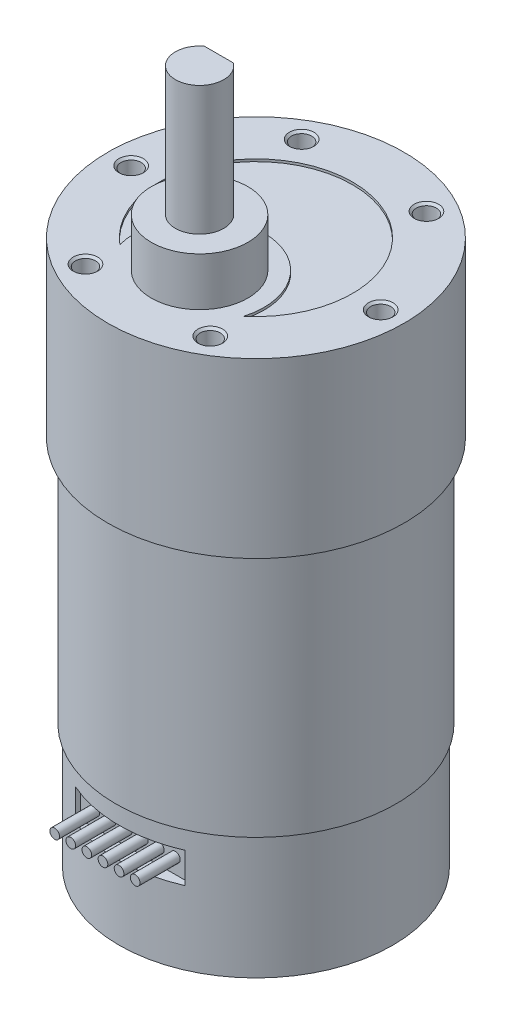
ISO-10303-21;
HEADER;
FILE_DESCRIPTION(('STEP AP214'),'2;1');
FILE_NAME('part.step','',(''),(''),'','','');
FILE_SCHEMA(('AUTOMOTIVE_DESIGN { 1 0 10303 214 1 1 1 1 }'));
ENDSEC;
DATA;
#1=APPLICATION_CONTEXT('core data for automotive mechanical design processes');
#2=APPLICATION_PROTOCOL_DEFINITION('international standard','automotive_design',2000,#1);
#3=PRODUCT_CONTEXT('',#1,'mechanical');
#4=PRODUCT('Part','Part','',(#3));
#5=PRODUCT_RELATED_PRODUCT_CATEGORY('part','',(#4));
#6=PRODUCT_DEFINITION_FORMATION('','',#4);
#7=PRODUCT_DEFINITION_CONTEXT('part definition',#1,'design');
#8=PRODUCT_DEFINITION('design','',#6,#7);
#9=PRODUCT_DEFINITION_SHAPE('','',#8);
#10=(LENGTH_UNIT() NAMED_UNIT(*) SI_UNIT(.MILLI.,.METRE.));
#11=(NAMED_UNIT(*) PLANE_ANGLE_UNIT() SI_UNIT($,.RADIAN.));
#12=(NAMED_UNIT(*) SI_UNIT($,.STERADIAN.) SOLID_ANGLE_UNIT());
#13=UNCERTAINTY_MEASURE_WITH_UNIT(LENGTH_MEASURE(1.E-05),#10,'distance_accuracy_value','');
#14=(GEOMETRIC_REPRESENTATION_CONTEXT(3) GLOBAL_UNCERTAINTY_ASSIGNED_CONTEXT((#13)) GLOBAL_UNIT_ASSIGNED_CONTEXT((#10,
#11,#12)) REPRESENTATION_CONTEXT('',''));
#15=CARTESIAN_POINT('',(0.,0.,0.));
#16=DIRECTION('',(0.,0.,1.));
#17=DIRECTION('',(1.,0.,0.));
#18=AXIS2_PLACEMENT_3D('',#15,#16,#17);
#19=CARTESIAN_POINT('',(0.,-67.6,0.));
#20=DIRECTION('',(0.,1.,0.));
#21=DIRECTION('',(0.,0.,1.));
#22=AXIS2_PLACEMENT_3D('',#19,#20,#21);
#23=CYLINDRICAL_SURFACE('',#22,17.);
#24=CARTESIAN_POINT('',(0.,-52.2,0.));
#25=DIRECTION('',(0.,-1.,0.));
#26=DIRECTION('',(0.,0.,-1.));
#27=AXIS2_PLACEMENT_3D('',#24,#25,#26);
#28=CIRCLE('',#27,17.);
#29=CARTESIAN_POINT('',(0.,-52.2,-17.));
#30=VERTEX_POINT('',#29);
#31=EDGE_CURVE('E249',#30,#30,#28,.T.);
#32=ORIENTED_EDGE('',*,*,#31,.T.);
#33=EDGE_LOOP('',(#32));
#34=FACE_BOUND('',#33,.T.);
#35=CARTESIAN_POINT('',(0.,-67.6,0.));
#36=DIRECTION('',(0.,-1.,0.));
#37=DIRECTION('',(0.,0.,-1.));
#38=AXIS2_PLACEMENT_3D('',#35,#36,#37);
#39=CIRCLE('',#38,17.);
#40=CARTESIAN_POINT('',(0.,-67.6,-17.));
#41=VERTEX_POINT('',#40);
#42=EDGE_CURVE('E250',#41,#41,#39,.T.);
#43=ORIENTED_EDGE('',*,*,#42,.F.);
#44=EDGE_LOOP('',(#43));
#45=FACE_BOUND('',#44,.T.);
#46=DIRECTION('',(0.,1.,0.));
#47=VECTOR('',#46,1.);
#48=CARTESIAN_POINT('',(-6.8,-67.6,15.5807573628499));
#49=LINE('',#48,#47);
#50=CARTESIAN_POINT('',(-6.8,-54.7,15.5807573628499));
#51=VERTEX_POINT('',#50);
#52=CARTESIAN_POINT('',(-6.8,-58.5,15.5807573628499));
#53=VERTEX_POINT('',#52);
#54=EDGE_CURVE('E11',#51,#53,#49,.F.);
#55=ORIENTED_EDGE('',*,*,#54,.F.);
#56=CARTESIAN_POINT('',(0.,-54.7,0.));
#57=DIRECTION('',(0.,-1.,0.));
#58=DIRECTION('',(0.,0.,-1.));
#59=AXIS2_PLACEMENT_3D('',#56,#57,#58);
#60=CIRCLE('',#59,17.);
#61=CARTESIAN_POINT('',(6.8,-54.7,15.5807573628499));
#62=VERTEX_POINT('',#61);
#63=EDGE_CURVE('E292',#62,#51,#60,.T.);
#64=ORIENTED_EDGE('',*,*,#63,.F.);
#65=DIRECTION('',(0.,1.,0.));
#66=VECTOR('',#65,1.);
#67=CARTESIAN_POINT('',(6.8,-67.6,15.5807573628499));
#68=LINE('',#67,#66);
#69=CARTESIAN_POINT('',(6.8,-58.5,15.5807573628499));
#70=VERTEX_POINT('',#69);
#71=EDGE_CURVE('E294',#70,#62,#68,.T.);
#72=ORIENTED_EDGE('',*,*,#71,.F.);
#73=CARTESIAN_POINT('',(0.,-58.5,0.));
#74=DIRECTION('',(0.,1.,0.));
#75=DIRECTION('',(0.,0.,1.));
#76=AXIS2_PLACEMENT_3D('',#73,#74,#75);
#77=CIRCLE('',#76,17.);
#78=EDGE_CURVE('E46',#53,#70,#77,.T.);
#79=ORIENTED_EDGE('',*,*,#78,.F.);
#80=EDGE_LOOP('',(#55,#64,#72,#79));
#81=FACE_BOUND('',#80,.T.);
#82=ADVANCED_FACE('F38',(#34,#45,#81),#23,.T.);
#83=CARTESIAN_POINT('',(0.,-21.5,0.));
#84=DIRECTION('',(0.,1.,0.));
#85=DIRECTION('',(0.,0.,1.));
#86=AXIS2_PLACEMENT_3D('',#83,#84,#85);
#87=CYLINDRICAL_SURFACE('',#86,18.4);
#88=CARTESIAN_POINT('',(0.,-21.5,0.));
#89=DIRECTION('',(0.,1.,0.));
#90=DIRECTION('',(0.,0.,1.));
#91=AXIS2_PLACEMENT_3D('',#88,#89,#90);
#92=CIRCLE('',#91,18.4);
#93=CARTESIAN_POINT('',(0.,-21.5,18.4));
#94=VERTEX_POINT('',#93);
#95=EDGE_CURVE('E280',#94,#94,#92,.T.);
#96=ORIENTED_EDGE('',*,*,#95,.T.);
#97=EDGE_LOOP('',(#96));
#98=FACE_BOUND('',#97,.T.);
#99=CARTESIAN_POINT('',(0.,0.,0.));
#100=DIRECTION('',(0.,1.,0.));
#101=DIRECTION('',(0.,0.,1.));
#102=AXIS2_PLACEMENT_3D('',#99,#100,#101);
#103=CIRCLE('',#102,18.4);
#104=CARTESIAN_POINT('',(0.,0.,18.4));
#105=VERTEX_POINT('',#104);
#106=EDGE_CURVE('E277',#105,#105,#103,.T.);
#107=ORIENTED_EDGE('',*,*,#106,.F.);
#108=EDGE_LOOP('',(#107));
#109=FACE_BOUND('',#108,.T.);
#110=ADVANCED_FACE('F40',(#98,#109),#87,.T.);
#111=CARTESIAN_POINT('',(0.,-21.5,0.));
#112=DIRECTION('',(0.,1.,0.));
#113=DIRECTION('',(0.,0.,1.));
#114=AXIS2_PLACEMENT_3D('',#111,#112,#113);
#115=PLANE('',#114);
#116=CARTESIAN_POINT('',(0.,-21.5,0.));
#117=DIRECTION('',(0.,1.,0.));
#118=DIRECTION('',(0.,0.,1.));
#119=AXIS2_PLACEMENT_3D('',#116,#117,#118);
#120=CIRCLE('',#119,17.4);
#121=CARTESIAN_POINT('',(0.,-21.5,17.4));
#122=VERTEX_POINT('',#121);
#123=EDGE_CURVE('E289',#122,#122,#120,.F.);
#124=ORIENTED_EDGE('',*,*,#123,.F.);
#125=EDGE_LOOP('',(#124));
#126=FACE_BOUND('',#125,.T.);
#127=ORIENTED_EDGE('',*,*,#95,.F.);
#128=EDGE_LOOP('',(#127));
#129=FACE_BOUND('',#128,.T.);
#130=ADVANCED_FACE('F335',(#126,#129),#115,.F.);
#131=CARTESIAN_POINT('',(0.,0.,0.));
#132=DIRECTION('',(0.,1.,0.));
#133=DIRECTION('',(0.,0.,1.));
#134=AXIS2_PLACEMENT_3D('',#131,#132,#133);
#135=PLANE('',#134);
#136=CARTESIAN_POINT('',(0.,0.,7.));
#137=DIRECTION('',(0.,-1.,0.));
#138=DIRECTION('',(0.,0.,1.));
#139=AXIS2_PLACEMENT_3D('',#136,#137,#138);
#140=CIRCLE('',#139,8.);
#141=CARTESIAN_POINT('',(-7.6874533348509,0.,9.21428571428572));
#142=VERTEX_POINT('',#141);
#143=CARTESIAN_POINT('',(7.6874533348509,0.,9.21428571428571));
#144=VERTEX_POINT('',#143);
#145=EDGE_CURVE('E53',#142,#144,#140,.T.);
#146=ORIENTED_EDGE('',*,*,#145,.F.);
#147=CARTESIAN_POINT('',(0.,0.,0.));
#148=DIRECTION('',(0.,1.,0.));
#149=DIRECTION('',(0.,0.,1.));
#150=AXIS2_PLACEMENT_3D('',#147,#148,#149);
#151=CIRCLE('',#150,12.);
#152=EDGE_CURVE('E132',#144,#142,#151,.T.);
#153=ORIENTED_EDGE('',*,*,#152,.F.);
#154=EDGE_LOOP('',(#146,#153));
#155=FACE_BOUND('',#154,.T.);
#156=CARTESIAN_POINT('',(-7.75,0.,-13.4233937586588));
#157=DIRECTION('',(0.,1.,0.));
#158=DIRECTION('',(0.,0.,1.));
#159=AXIS2_PLACEMENT_3D('',#156,#157,#158);
#160=CIRCLE('',#159,1.525);
#161=CARTESIAN_POINT('',(-7.75,0.,-11.8983937586588));
#162=VERTEX_POINT('',#161);
#163=EDGE_CURVE('E139',#162,#162,#160,.T.);
#164=ORIENTED_EDGE('',*,*,#163,.F.);
#165=EDGE_LOOP('',(#164));
#166=FACE_BOUND('',#165,.T.);
#167=CARTESIAN_POINT('',(15.5,0.,0.));
#168=DIRECTION('',(0.,1.,0.));
#169=DIRECTION('',(0.,0.,1.));
#170=AXIS2_PLACEMENT_3D('',#167,#168,#169);
#171=CIRCLE('',#170,1.525);
#172=CARTESIAN_POINT('',(15.5,0.,1.525));
#173=VERTEX_POINT('',#172);
#174=EDGE_CURVE('E149',#173,#173,#171,.T.);
#175=ORIENTED_EDGE('',*,*,#174,.F.);
#176=EDGE_LOOP('',(#175));
#177=FACE_BOUND('',#176,.T.);
#178=CARTESIAN_POINT('',(7.75,0.,13.4233937586588));
#179=DIRECTION('',(0.,1.,0.));
#180=DIRECTION('',(0.,0.,1.));
#181=AXIS2_PLACEMENT_3D('',#178,#179,#180);
#182=CIRCLE('',#181,1.525);
#183=CARTESIAN_POINT('',(7.75,0.,14.9483937586588));
#184=VERTEX_POINT('',#183);
#185=EDGE_CURVE('E158',#184,#184,#182,.T.);
#186=ORIENTED_EDGE('',*,*,#185,.F.);
#187=EDGE_LOOP('',(#186));
#188=FACE_BOUND('',#187,.T.);
#189=CARTESIAN_POINT('',(-7.75,0.,13.4233937586588));
#190=DIRECTION('',(0.,1.,0.));
#191=DIRECTION('',(0.,0.,1.));
#192=AXIS2_PLACEMENT_3D('',#189,#190,#191);
#193=CIRCLE('',#192,1.525);
#194=CARTESIAN_POINT('',(-7.75,0.,14.9483937586588));
#195=VERTEX_POINT('',#194);
#196=EDGE_CURVE('E167',#195,#195,#193,.T.);
#197=ORIENTED_EDGE('',*,*,#196,.F.);
#198=EDGE_LOOP('',(#197));
#199=FACE_BOUND('',#198,.T.);
#200=CARTESIAN_POINT('',(-15.5,0.,0.));
#201=DIRECTION('',(0.,1.,0.));
#202=DIRECTION('',(0.,0.,1.));
#203=AXIS2_PLACEMENT_3D('',#200,#201,#202);
#204=CIRCLE('',#203,1.525);
#205=CARTESIAN_POINT('',(-15.5,0.,1.525));
#206=VERTEX_POINT('',#205);
#207=EDGE_CURVE('E176',#206,#206,#204,.T.);
#208=ORIENTED_EDGE('',*,*,#207,.F.);
#209=EDGE_LOOP('',(#208));
#210=FACE_BOUND('',#209,.T.);
#211=CARTESIAN_POINT('',(7.75,0.,-13.4233937586588));
#212=DIRECTION('',(0.,1.,0.));
#213=DIRECTION('',(0.,0.,1.));
#214=AXIS2_PLACEMENT_3D('',#211,#212,#213);
#215=CIRCLE('',#214,1.525);
#216=CARTESIAN_POINT('',(7.75,0.,-11.8983937586588));
#217=VERTEX_POINT('',#216);
#218=EDGE_CURVE('E185',#217,#217,#215,.T.);
#219=ORIENTED_EDGE('',*,*,#218,.F.);
#220=EDGE_LOOP('',(#219));
#221=FACE_BOUND('',#220,.T.);
#222=CARTESIAN_POINT('',(0.,0.,7.));
#223=DIRECTION('',(0.,1.,0.));
#224=DIRECTION('',(0.,0.,1.));
#225=AXIS2_PLACEMENT_3D('',#222,#223,#224);
#226=CIRCLE('',#225,6.);
#227=CARTESIAN_POINT('',(0.,0.,13.));
#228=VERTEX_POINT('',#227);
#229=EDGE_CURVE('E271',#228,#228,#226,.T.);
#230=ORIENTED_EDGE('',*,*,#229,.F.);
#231=EDGE_LOOP('',(#230));
#232=FACE_BOUND('',#231,.T.);
#233=ORIENTED_EDGE('',*,*,#106,.T.);
#234=EDGE_LOOP('',(#233));
#235=FACE_BOUND('',#234,.T.);
#236=ADVANCED_FACE('F373',(#155,#166,#177,#188,#199,#210,#221,#232,#235),#135,.T.);
#237=CARTESIAN_POINT('',(0.,6.,7.));
#238=DIRECTION('',(0.,-1.,0.));
#239=DIRECTION('',(0.,0.,-1.));
#240=AXIS2_PLACEMENT_3D('',#237,#238,#239);
#241=CYLINDRICAL_SURFACE('',#240,6.);
#242=CARTESIAN_POINT('',(0.,6.,7.));
#243=DIRECTION('',(0.,1.,0.));
#244=DIRECTION('',(0.,0.,1.));
#245=AXIS2_PLACEMENT_3D('',#242,#243,#244);
#246=CIRCLE('',#245,6.);
#247=CARTESIAN_POINT('',(0.,6.,13.));
#248=VERTEX_POINT('',#247);
#249=EDGE_CURVE('E274',#248,#248,#246,.T.);
#250=ORIENTED_EDGE('',*,*,#249,.F.);
#251=EDGE_LOOP('',(#250));
#252=FACE_BOUND('',#251,.T.);
#253=ORIENTED_EDGE('',*,*,#229,.T.);
#254=EDGE_LOOP('',(#253));
#255=FACE_BOUND('',#254,.T.);
#256=ADVANCED_FACE('F369',(#252,#255),#241,.T.);
#257=CARTESIAN_POINT('',(0.,6.,7.));
#258=DIRECTION('',(0.,1.,0.));
#259=DIRECTION('',(0.,0.,1.));
#260=AXIS2_PLACEMENT_3D('',#257,#258,#259);
#261=PLANE('',#260);
#262=CARTESIAN_POINT('',(0.,6.,7.));
#263=DIRECTION('',(0.,1.,0.));
#264=DIRECTION('',(0.,0.,1.));
#265=AXIS2_PLACEMENT_3D('',#262,#263,#264);
#266=CIRCLE('',#265,3.);
#267=CARTESIAN_POINT('',(0.,6.,10.));
#268=VERTEX_POINT('',#267);
#269=EDGE_CURVE('E267',#268,#268,#266,.T.);
#270=ORIENTED_EDGE('',*,*,#269,.F.);
#271=EDGE_LOOP('',(#270));
#272=FACE_BOUND('',#271,.T.);
#273=ORIENTED_EDGE('',*,*,#249,.T.);
#274=EDGE_LOOP('',(#273));
#275=FACE_BOUND('',#274,.T.);
#276=ADVANCED_FACE('F365',(#272,#275),#261,.T.);
#277=CARTESIAN_POINT('',(0.,22.,7.));
#278=DIRECTION('',(0.,-1.,0.));
#279=DIRECTION('',(0.,0.,-1.));
#280=AXIS2_PLACEMENT_3D('',#277,#278,#279);
#281=CYLINDRICAL_SURFACE('',#280,3.);
#282=CARTESIAN_POINT('',(0.,22.,7.));
#283=DIRECTION('',(0.,1.,0.));
#284=DIRECTION('',(0.,0.,1.));
#285=AXIS2_PLACEMENT_3D('',#282,#283,#284);
#286=CIRCLE('',#285,3.);
#287=CARTESIAN_POINT('',(-1.8,22.,4.6));
#288=VERTEX_POINT('',#287);
#289=CARTESIAN_POINT('',(1.8,22.,4.6));
#290=VERTEX_POINT('',#289);
#291=EDGE_CURVE('E268',#288,#290,#286,.T.);
#292=ORIENTED_EDGE('',*,*,#291,.F.);
#293=DIRECTION('',(0.,-1.,0.));
#294=VECTOR('',#293,1.);
#295=CARTESIAN_POINT('',(-1.8,22.,4.6));
#296=LINE('',#295,#294);
#297=CARTESIAN_POINT('',(-1.8,10.15,4.6));
#298=VERTEX_POINT('',#297);
#299=EDGE_CURVE('E264',#288,#298,#296,.T.);
#300=ORIENTED_EDGE('',*,*,#299,.T.);
#301=CARTESIAN_POINT('',(0.,10.15,7.));
#302=DIRECTION('',(0.,1.,0.));
#303=DIRECTION('',(0.,0.,1.));
#304=AXIS2_PLACEMENT_3D('',#301,#302,#303);
#305=CIRCLE('',#304,3.);
#306=CARTESIAN_POINT('',(1.8,10.15,4.6));
#307=VERTEX_POINT('',#306);
#308=EDGE_CURVE('E287',#307,#298,#305,.T.);
#309=ORIENTED_EDGE('',*,*,#308,.F.);
#310=DIRECTION('',(0.,-1.,0.));
#311=VECTOR('',#310,1.);
#312=CARTESIAN_POINT('',(1.8,22.,4.6));
#313=LINE('',#312,#311);
#314=EDGE_CURVE('E261',#307,#290,#313,.F.);
#315=ORIENTED_EDGE('',*,*,#314,.T.);
#316=EDGE_LOOP('',(#292,#300,#309,#315));
#317=FACE_BOUND('',#316,.T.);
#318=ORIENTED_EDGE('',*,*,#269,.T.);
#319=EDGE_LOOP('',(#318));
#320=FACE_BOUND('',#319,.T.);
#321=ADVANCED_FACE('F361',(#317,#320),#281,.T.);
#322=CARTESIAN_POINT('',(0.,22.,7.));
#323=DIRECTION('',(0.,1.,0.));
#324=DIRECTION('',(0.,0.,1.));
#325=AXIS2_PLACEMENT_3D('',#322,#323,#324);
#326=PLANE('',#325);
#327=DIRECTION('',(1.,0.,0.));
#328=VECTOR('',#327,1.);
#329=CARTESIAN_POINT('',(0.,22.,4.6));
#330=LINE('',#329,#328);
#331=EDGE_CURVE('E283',#288,#290,#330,.T.);
#332=ORIENTED_EDGE('',*,*,#331,.F.);
#333=ORIENTED_EDGE('',*,*,#291,.T.);
#334=EDGE_LOOP('',(#332,#333));
#335=FACE_BOUND('',#334,.T.);
#336=ADVANCED_FACE('F354',(#335),#326,.T.);
#337=CARTESIAN_POINT('',(0.,10.15,0.));
#338=DIRECTION('',(0.,1.,0.));
#339=DIRECTION('',(0.,0.,1.));
#340=AXIS2_PLACEMENT_3D('',#337,#338,#339);
#341=PLANE('',#340);
#342=ORIENTED_EDGE('',*,*,#308,.T.);
#343=DIRECTION('',(1.,0.,0.));
#344=VECTOR('',#343,1.);
#345=CARTESIAN_POINT('',(-2.5,10.15,4.6));
#346=LINE('',#345,#344);
#347=EDGE_CURVE('E258',#298,#307,#346,.T.);
#348=ORIENTED_EDGE('',*,*,#347,.T.);
#349=EDGE_LOOP('',(#342,#348));
#350=FACE_BOUND('',#349,.T.);
#351=ADVANCED_FACE('F351',(#350),#341,.T.);
#352=CARTESIAN_POINT('',(-2.5,10.15,4.6));
#353=DIRECTION('',(0.,0.,1.));
#354=DIRECTION('',(1.,0.,0.));
#355=AXIS2_PLACEMENT_3D('',#352,#353,#354);
#356=PLANE('',#355);
#357=ORIENTED_EDGE('',*,*,#331,.T.);
#358=ORIENTED_EDGE('',*,*,#314,.F.);
#359=ORIENTED_EDGE('',*,*,#347,.F.);
#360=ORIENTED_EDGE('',*,*,#299,.F.);
#361=EDGE_LOOP('',(#357,#358,#359,#360));
#362=FACE_BOUND('',#361,.T.);
#363=ADVANCED_FACE('F349',(#362),#356,.F.);
#364=CARTESIAN_POINT('',(0.,-52.2,0.));
#365=DIRECTION('',(0.,1.,0.));
#366=DIRECTION('',(0.,0.,1.));
#367=AXIS2_PLACEMENT_3D('',#364,#365,#366);
#368=CYLINDRICAL_SURFACE('',#367,17.4);
#369=CARTESIAN_POINT('',(0.,-52.2,0.));
#370=DIRECTION('',(0.,-1.,0.));
#371=DIRECTION('',(0.,0.,-1.));
#372=AXIS2_PLACEMENT_3D('',#369,#370,#371);
#373=CIRCLE('',#372,17.4);
#374=CARTESIAN_POINT('',(0.,-52.2,-17.4));
#375=VERTEX_POINT('',#374);
#376=EDGE_CURVE('E253',#375,#375,#373,.T.);
#377=ORIENTED_EDGE('',*,*,#376,.F.);
#378=EDGE_LOOP('',(#377));
#379=FACE_BOUND('',#378,.T.);
#380=ORIENTED_EDGE('',*,*,#123,.T.);
#381=EDGE_LOOP('',(#380));
#382=FACE_BOUND('',#381,.T.);
#383=ADVANCED_FACE('F345',(#379,#382),#368,.T.);
#384=CARTESIAN_POINT('',(0.,-52.2,0.));
#385=DIRECTION('',(0.,-1.,0.));
#386=DIRECTION('',(0.,0.,-1.));
#387=AXIS2_PLACEMENT_3D('',#384,#385,#386);
#388=PLANE('',#387);
#389=ORIENTED_EDGE('',*,*,#31,.F.);
#390=EDGE_LOOP('',(#389));
#391=FACE_BOUND('',#390,.T.);
#392=ORIENTED_EDGE('',*,*,#376,.T.);
#393=EDGE_LOOP('',(#392));
#394=FACE_BOUND('',#393,.T.);
#395=ADVANCED_FACE('F342',(#391,#394),#388,.T.);
#396=CARTESIAN_POINT('',(0.,-67.6,0.));
#397=DIRECTION('',(0.,-1.,0.));
#398=DIRECTION('',(0.,0.,-1.));
#399=AXIS2_PLACEMENT_3D('',#396,#397,#398);
#400=PLANE('',#399);
#401=ORIENTED_EDGE('',*,*,#42,.T.);
#402=EDGE_LOOP('',(#401));
#403=FACE_BOUND('',#402,.T.);
#404=ADVANCED_FACE('F340',(#403),#400,.T.);
#405=CARTESIAN_POINT('',(-6.8,-58.5,18.4));
#406=DIRECTION('',(1.,0.,0.));
#407=DIRECTION('',(0.,0.,-1.));
#408=AXIS2_PLACEMENT_3D('',#405,#406,#407);
#409=PLANE('',#408);
#410=ORIENTED_EDGE('',*,*,#54,.T.);
#411=DIRECTION('',(0.,0.,-1.));
#412=VECTOR('',#411,1.);
#413=CARTESIAN_POINT('',(-6.8,-58.5,18.4));
#414=LINE('',#413,#412);
#415=CARTESIAN_POINT('',(-6.8,-58.5,15.));
#416=VERTEX_POINT('',#415);
#417=EDGE_CURVE('E247',#53,#416,#414,.T.);
#418=ORIENTED_EDGE('',*,*,#417,.T.);
#419=DIRECTION('',(0.,-1.,0.));
#420=VECTOR('',#419,1.);
#421=CARTESIAN_POINT('',(-6.8,-58.5,15.));
#422=LINE('',#421,#420);
#423=CARTESIAN_POINT('',(-6.8,-54.7,15.));
#424=VERTEX_POINT('',#423);
#425=EDGE_CURVE('E228',#424,#416,#422,.T.);
#426=ORIENTED_EDGE('',*,*,#425,.F.);
#427=DIRECTION('',(0.,0.,-1.));
#428=VECTOR('',#427,1.);
#429=CARTESIAN_POINT('',(-6.8,-54.7,18.4));
#430=LINE('',#429,#428);
#431=EDGE_CURVE('E242',#51,#424,#430,.T.);
#432=ORIENTED_EDGE('',*,*,#431,.F.);
#433=EDGE_LOOP('',(#410,#418,#426,#432));
#434=FACE_BOUND('',#433,.T.);
#435=ADVANCED_FACE('F312',(#434),#409,.T.);
#436=CARTESIAN_POINT('',(6.8,-58.5,18.4));
#437=DIRECTION('',(0.,1.,0.));
#438=DIRECTION('',(0.,0.,1.));
#439=AXIS2_PLACEMENT_3D('',#436,#437,#438);
#440=PLANE('',#439);
#441=ORIENTED_EDGE('',*,*,#78,.T.);
#442=DIRECTION('',(0.,0.,-1.));
#443=VECTOR('',#442,1.);
#444=CARTESIAN_POINT('',(6.8,-58.5,18.4));
#445=LINE('',#444,#443);
#446=CARTESIAN_POINT('',(6.8,-58.5,15.));
#447=VERTEX_POINT('',#446);
#448=EDGE_CURVE('E245',#70,#447,#445,.T.);
#449=ORIENTED_EDGE('',*,*,#448,.T.);
#450=DIRECTION('',(1.,0.,0.));
#451=VECTOR('',#450,1.);
#452=CARTESIAN_POINT('',(6.8,-58.5,15.));
#453=LINE('',#452,#451);
#454=EDGE_CURVE('E233',#416,#447,#453,.T.);
#455=ORIENTED_EDGE('',*,*,#454,.F.);
#456=ORIENTED_EDGE('',*,*,#417,.F.);
#457=EDGE_LOOP('',(#441,#449,#455,#456));
#458=FACE_BOUND('',#457,.T.);
#459=ADVANCED_FACE('F299',(#458),#440,.T.);
#460=CARTESIAN_POINT('',(6.8,-58.5,18.4));
#461=DIRECTION('',(-1.,0.,0.));
#462=DIRECTION('',(0.,0.,1.));
#463=AXIS2_PLACEMENT_3D('',#460,#461,#462);
#464=PLANE('',#463);
#465=ORIENTED_EDGE('',*,*,#71,.T.);
#466=DIRECTION('',(0.,0.,-1.));
#467=VECTOR('',#466,1.);
#468=CARTESIAN_POINT('',(6.8,-54.7,18.4));
#469=LINE('',#468,#467);
#470=CARTESIAN_POINT('',(6.8,-54.7,15.));
#471=VERTEX_POINT('',#470);
#472=EDGE_CURVE('E61',#62,#471,#469,.T.);
#473=ORIENTED_EDGE('',*,*,#472,.T.);
#474=DIRECTION('',(0.,1.,0.));
#475=VECTOR('',#474,1.);
#476=CARTESIAN_POINT('',(6.8,-58.5,15.));
#477=LINE('',#476,#475);
#478=EDGE_CURVE('E236',#447,#471,#477,.T.);
#479=ORIENTED_EDGE('',*,*,#478,.F.);
#480=ORIENTED_EDGE('',*,*,#448,.F.);
#481=EDGE_LOOP('',(#465,#473,#479,#480));
#482=FACE_BOUND('',#481,.T.);
#483=ADVANCED_FACE('F306',(#482),#464,.T.);
#484=CARTESIAN_POINT('',(6.8,-54.7,18.4));
#485=DIRECTION('',(0.,-1.,0.));
#486=DIRECTION('',(0.,0.,-1.));
#487=AXIS2_PLACEMENT_3D('',#484,#485,#486);
#488=PLANE('',#487);
#489=ORIENTED_EDGE('',*,*,#63,.T.);
#490=ORIENTED_EDGE('',*,*,#431,.T.);
#491=DIRECTION('',(-1.,0.,0.));
#492=VECTOR('',#491,1.);
#493=CARTESIAN_POINT('',(6.8,-54.7,15.));
#494=LINE('',#493,#492);
#495=EDGE_CURVE('E239',#471,#424,#494,.T.);
#496=ORIENTED_EDGE('',*,*,#495,.F.);
#497=ORIENTED_EDGE('',*,*,#472,.F.);
#498=EDGE_LOOP('',(#489,#490,#496,#497));
#499=FACE_BOUND('',#498,.T.);
#500=ADVANCED_FACE('F309',(#499),#488,.T.);
#501=CARTESIAN_POINT('',(0.,0.,15.));
#502=DIRECTION('',(0.,0.,1.));
#503=DIRECTION('',(1.,0.,0.));
#504=AXIS2_PLACEMENT_3D('',#501,#502,#503);
#505=PLANE('',#504);
#506=CARTESIAN_POINT('',(5.,-56.6,15.));
#507=DIRECTION('',(0.,0.,1.));
#508=DIRECTION('',(-1.,0.,0.));
#509=AXIS2_PLACEMENT_3D('',#506,#507,#508);
#510=CIRCLE('',#509,0.600000000000004);
#511=CARTESIAN_POINT('',(4.4,-56.6,15.));
#512=VERTEX_POINT('',#511);
#513=EDGE_CURVE('E194',#512,#512,#510,.T.);
#514=ORIENTED_EDGE('',*,*,#513,.F.);
#515=EDGE_LOOP('',(#514));
#516=FACE_BOUND('',#515,.T.);
#517=CARTESIAN_POINT('',(3.,-56.6,15.));
#518=DIRECTION('',(0.,0.,1.));
#519=DIRECTION('',(-1.,0.,0.));
#520=AXIS2_PLACEMENT_3D('',#517,#518,#519);
#521=CIRCLE('',#520,0.600000000000004);
#522=CARTESIAN_POINT('',(2.4,-56.6,15.));
#523=VERTEX_POINT('',#522);
#524=EDGE_CURVE('E198',#523,#523,#521,.T.);
#525=ORIENTED_EDGE('',*,*,#524,.F.);
#526=EDGE_LOOP('',(#525));
#527=FACE_BOUND('',#526,.T.);
#528=CARTESIAN_POINT('',(1.,-56.6,15.));
#529=DIRECTION('',(0.,0.,1.));
#530=DIRECTION('',(-1.,0.,0.));
#531=AXIS2_PLACEMENT_3D('',#528,#529,#530);
#532=CIRCLE('',#531,0.600000000000003);
#533=CARTESIAN_POINT('',(0.399999999999997,-56.6,15.));
#534=VERTEX_POINT('',#533);
#535=EDGE_CURVE('E204',#534,#534,#532,.T.);
#536=ORIENTED_EDGE('',*,*,#535,.F.);
#537=EDGE_LOOP('',(#536));
#538=FACE_BOUND('',#537,.T.);
#539=CARTESIAN_POINT('',(-1.,-56.6,15.));
#540=DIRECTION('',(0.,0.,1.));
#541=DIRECTION('',(1.,0.,0.));
#542=AXIS2_PLACEMENT_3D('',#539,#540,#541);
#543=CIRCLE('',#542,0.600000000000003);
#544=CARTESIAN_POINT('',(-0.399999999999997,-56.6,15.));
#545=VERTEX_POINT('',#544);
#546=EDGE_CURVE('E210',#545,#545,#543,.T.);
#547=ORIENTED_EDGE('',*,*,#546,.F.);
#548=EDGE_LOOP('',(#547));
#549=FACE_BOUND('',#548,.T.);
#550=CARTESIAN_POINT('',(-3.,-56.6,15.));
#551=DIRECTION('',(0.,0.,1.));
#552=DIRECTION('',(1.,0.,0.));
#553=AXIS2_PLACEMENT_3D('',#550,#551,#552);
#554=CIRCLE('',#553,0.600000000000003);
#555=CARTESIAN_POINT('',(-2.4,-56.6,15.));
#556=VERTEX_POINT('',#555);
#557=EDGE_CURVE('E216',#556,#556,#554,.T.);
#558=ORIENTED_EDGE('',*,*,#557,.F.);
#559=EDGE_LOOP('',(#558));
#560=FACE_BOUND('',#559,.T.);
#561=CARTESIAN_POINT('',(-5.,-56.6,15.));
#562=DIRECTION('',(0.,0.,1.));
#563=DIRECTION('',(1.,0.,0.));
#564=AXIS2_PLACEMENT_3D('',#561,#562,#563);
#565=CIRCLE('',#564,0.600000000000004);
#566=CARTESIAN_POINT('',(-4.4,-56.6,15.));
#567=VERTEX_POINT('',#566);
#568=EDGE_CURVE('E222',#567,#567,#565,.T.);
#569=ORIENTED_EDGE('',*,*,#568,.F.);
#570=EDGE_LOOP('',(#569));
#571=FACE_BOUND('',#570,.T.);
#572=ORIENTED_EDGE('',*,*,#425,.T.);
#573=ORIENTED_EDGE('',*,*,#454,.T.);
#574=ORIENTED_EDGE('',*,*,#478,.T.);
#575=ORIENTED_EDGE('',*,*,#495,.T.);
#576=EDGE_LOOP('',(#572,#573,#574,#575));
#577=FACE_BOUND('',#576,.T.);
#578=ADVANCED_FACE('F314',(#516,#527,#538,#549,#560,#571,#577),#505,.T.);
#579=CARTESIAN_POINT('',(-5.,-56.6,20.));
#580=DIRECTION('',(0.,0.,-1.));
#581=DIRECTION('',(-1.,0.,0.));
#582=AXIS2_PLACEMENT_3D('',#579,#580,#581);
#583=CYLINDRICAL_SURFACE('',#582,0.600000000000004);
#584=CARTESIAN_POINT('',(-5.,-56.6,20.));
#585=DIRECTION('',(0.,0.,1.));
#586=DIRECTION('',(1.,0.,0.));
#587=AXIS2_PLACEMENT_3D('',#584,#585,#586);
#588=CIRCLE('',#587,0.600000000000004);
#589=CARTESIAN_POINT('',(-4.4,-56.6,20.));
#590=VERTEX_POINT('',#589);
#591=EDGE_CURVE('E225',#590,#590,#588,.T.);
#592=ORIENTED_EDGE('',*,*,#591,.F.);
#593=EDGE_LOOP('',(#592));
#594=FACE_BOUND('',#593,.T.);
#595=ORIENTED_EDGE('',*,*,#568,.T.);
#596=EDGE_LOOP('',(#595));
#597=FACE_BOUND('',#596,.T.);
#598=ADVANCED_FACE('F316',(#594,#597),#583,.T.);
#599=CARTESIAN_POINT('',(-5.,-56.6,20.));
#600=DIRECTION('',(0.,0.,1.));
#601=DIRECTION('',(1.,0.,0.));
#602=AXIS2_PLACEMENT_3D('',#599,#600,#601);
#603=PLANE('',#602);
#604=ORIENTED_EDGE('',*,*,#591,.T.);
#605=EDGE_LOOP('',(#604));
#606=FACE_BOUND('',#605,.T.);
#607=ADVANCED_FACE('F323',(#606),#603,.T.);
#608=CARTESIAN_POINT('',(-3.,-56.6,20.));
#609=DIRECTION('',(0.,0.,-1.));
#610=DIRECTION('',(-1.,0.,0.));
#611=AXIS2_PLACEMENT_3D('',#608,#609,#610);
#612=CYLINDRICAL_SURFACE('',#611,0.600000000000003);
#613=CARTESIAN_POINT('',(-3.,-56.6,20.));
#614=DIRECTION('',(0.,0.,1.));
#615=DIRECTION('',(1.,0.,0.));
#616=AXIS2_PLACEMENT_3D('',#613,#614,#615);
#617=CIRCLE('',#616,0.600000000000003);
#618=CARTESIAN_POINT('',(-2.4,-56.6,20.));
#619=VERTEX_POINT('',#618);
#620=EDGE_CURVE('E219',#619,#619,#617,.T.);
#621=ORIENTED_EDGE('',*,*,#620,.F.);
#622=EDGE_LOOP('',(#621));
#623=FACE_BOUND('',#622,.T.);
#624=ORIENTED_EDGE('',*,*,#557,.T.);
#625=EDGE_LOOP('',(#624));
#626=FACE_BOUND('',#625,.T.);
#627=ADVANCED_FACE('F457',(#623,#626),#612,.T.);
#628=CARTESIAN_POINT('',(-3.,-56.6,20.));
#629=DIRECTION('',(0.,0.,1.));
#630=DIRECTION('',(1.,0.,0.));
#631=AXIS2_PLACEMENT_3D('',#628,#629,#630);
#632=PLANE('',#631);
#633=ORIENTED_EDGE('',*,*,#620,.T.);
#634=EDGE_LOOP('',(#633));
#635=FACE_BOUND('',#634,.T.);
#636=ADVANCED_FACE('F453',(#635),#632,.T.);
#637=CARTESIAN_POINT('',(-1.,-56.6,20.));
#638=DIRECTION('',(0.,0.,-1.));
#639=DIRECTION('',(-1.,0.,0.));
#640=AXIS2_PLACEMENT_3D('',#637,#638,#639);
#641=CYLINDRICAL_SURFACE('',#640,0.600000000000003);
#642=CARTESIAN_POINT('',(-1.,-56.6,20.));
#643=DIRECTION('',(0.,0.,1.));
#644=DIRECTION('',(1.,0.,0.));
#645=AXIS2_PLACEMENT_3D('',#642,#643,#644);
#646=CIRCLE('',#645,0.600000000000003);
#647=CARTESIAN_POINT('',(-0.399999999999997,-56.6,20.));
#648=VERTEX_POINT('',#647);
#649=EDGE_CURVE('E213',#648,#648,#646,.T.);
#650=ORIENTED_EDGE('',*,*,#649,.F.);
#651=EDGE_LOOP('',(#650));
#652=FACE_BOUND('',#651,.T.);
#653=ORIENTED_EDGE('',*,*,#546,.T.);
#654=EDGE_LOOP('',(#653));
#655=FACE_BOUND('',#654,.T.);
#656=ADVANCED_FACE('F449',(#652,#655),#641,.T.);
#657=CARTESIAN_POINT('',(-1.,-56.6,20.));
#658=DIRECTION('',(0.,0.,1.));
#659=DIRECTION('',(1.,0.,0.));
#660=AXIS2_PLACEMENT_3D('',#657,#658,#659);
#661=PLANE('',#660);
#662=ORIENTED_EDGE('',*,*,#649,.T.);
#663=EDGE_LOOP('',(#662));
#664=FACE_BOUND('',#663,.T.);
#665=ADVANCED_FACE('F445',(#664),#661,.T.);
#666=CARTESIAN_POINT('',(1.,-56.6,20.));
#667=DIRECTION('',(0.,0.,-1.));
#668=DIRECTION('',(-1.,0.,0.));
#669=AXIS2_PLACEMENT_3D('',#666,#667,#668);
#670=CYLINDRICAL_SURFACE('',#669,0.600000000000003);
#671=CARTESIAN_POINT('',(1.,-56.6,20.));
#672=DIRECTION('',(0.,0.,1.));
#673=DIRECTION('',(-1.,0.,0.));
#674=AXIS2_PLACEMENT_3D('',#671,#672,#673);
#675=CIRCLE('',#674,0.600000000000003);
#676=CARTESIAN_POINT('',(0.399999999999997,-56.6,20.));
#677=VERTEX_POINT('',#676);
#678=EDGE_CURVE('E207',#677,#677,#675,.T.);
#679=ORIENTED_EDGE('',*,*,#678,.F.);
#680=EDGE_LOOP('',(#679));
#681=FACE_BOUND('',#680,.T.);
#682=ORIENTED_EDGE('',*,*,#535,.T.);
#683=EDGE_LOOP('',(#682));
#684=FACE_BOUND('',#683,.T.);
#685=ADVANCED_FACE('F441',(#681,#684),#670,.T.);
#686=CARTESIAN_POINT('',(1.,-56.6,20.));
#687=DIRECTION('',(0.,0.,-1.));
#688=DIRECTION('',(-1.,0.,0.));
#689=AXIS2_PLACEMENT_3D('',#686,#687,#688);
#690=PLANE('',#689);
#691=ORIENTED_EDGE('',*,*,#678,.T.);
#692=EDGE_LOOP('',(#691));
#693=FACE_BOUND('',#692,.T.);
#694=ADVANCED_FACE('F437',(#693),#690,.F.);
#695=CARTESIAN_POINT('',(3.,-56.6,20.));
#696=DIRECTION('',(0.,0.,-1.));
#697=DIRECTION('',(-1.,0.,0.));
#698=AXIS2_PLACEMENT_3D('',#695,#696,#697);
#699=CYLINDRICAL_SURFACE('',#698,0.600000000000004);
#700=CARTESIAN_POINT('',(3.,-56.6,20.));
#701=DIRECTION('',(0.,0.,1.));
#702=DIRECTION('',(-1.,0.,0.));
#703=AXIS2_PLACEMENT_3D('',#700,#701,#702);
#704=CIRCLE('',#703,0.600000000000004);
#705=CARTESIAN_POINT('',(2.4,-56.6,20.));
#706=VERTEX_POINT('',#705);
#707=EDGE_CURVE('E201',#706,#706,#704,.T.);
#708=ORIENTED_EDGE('',*,*,#707,.F.);
#709=EDGE_LOOP('',(#708));
#710=FACE_BOUND('',#709,.T.);
#711=ORIENTED_EDGE('',*,*,#524,.T.);
#712=EDGE_LOOP('',(#711));
#713=FACE_BOUND('',#712,.T.);
#714=ADVANCED_FACE('F433',(#710,#713),#699,.T.);
#715=CARTESIAN_POINT('',(3.,-56.6,20.));
#716=DIRECTION('',(0.,0.,-1.));
#717=DIRECTION('',(-1.,0.,0.));
#718=AXIS2_PLACEMENT_3D('',#715,#716,#717);
#719=PLANE('',#718);
#720=ORIENTED_EDGE('',*,*,#707,.T.);
#721=EDGE_LOOP('',(#720));
#722=FACE_BOUND('',#721,.T.);
#723=ADVANCED_FACE('F429',(#722),#719,.F.);
#724=CARTESIAN_POINT('',(5.,-56.6,20.));
#725=DIRECTION('',(0.,0.,-1.));
#726=DIRECTION('',(-1.,0.,0.));
#727=AXIS2_PLACEMENT_3D('',#724,#725,#726);
#728=CYLINDRICAL_SURFACE('',#727,0.600000000000004);
#729=CARTESIAN_POINT('',(5.,-56.6,20.));
#730=DIRECTION('',(0.,0.,1.));
#731=DIRECTION('',(-1.,0.,0.));
#732=AXIS2_PLACEMENT_3D('',#729,#730,#731);
#733=CIRCLE('',#732,0.600000000000004);
#734=CARTESIAN_POINT('',(4.4,-56.6,20.));
#735=VERTEX_POINT('',#734);
#736=EDGE_CURVE('E195',#735,#735,#733,.T.);
#737=ORIENTED_EDGE('',*,*,#736,.F.);
#738=EDGE_LOOP('',(#737));
#739=FACE_BOUND('',#738,.T.);
#740=ORIENTED_EDGE('',*,*,#513,.T.);
#741=EDGE_LOOP('',(#740));
#742=FACE_BOUND('',#741,.T.);
#743=ADVANCED_FACE('F425',(#739,#742),#728,.T.);
#744=CARTESIAN_POINT('',(5.,-56.6,20.));
#745=DIRECTION('',(0.,0.,-1.));
#746=DIRECTION('',(-1.,0.,0.));
#747=AXIS2_PLACEMENT_3D('',#744,#745,#746);
#748=PLANE('',#747);
#749=ORIENTED_EDGE('',*,*,#736,.T.);
#750=EDGE_LOOP('',(#749));
#751=FACE_BOUND('',#750,.T.);
#752=ADVANCED_FACE('F421',(#751),#748,.F.);
#753=CARTESIAN_POINT('',(7.75,-8.49999999999999,-13.4233937586588));
#754=DIRECTION('',(0.,1.,0.));
#755=DIRECTION('',(0.,0.,1.));
#756=AXIS2_PLACEMENT_3D('',#753,#754,#755);
#757=CONICAL_SURFACE('',#756,1.24999999999999,1.02974425867665);
#758=CARTESIAN_POINT('',(7.75,-9.25107577378444,-13.4233937586588));
#759=VERTEX_POINT('',#758);
#760=VERTEX_LOOP('',#759);
#761=FACE_BOUND('',#760,.T.);
#762=CARTESIAN_POINT('',(7.75,-8.49999999999999,-13.4233937586588));
#763=DIRECTION('',(0.,1.,0.));
#764=DIRECTION('',(0.,0.,1.));
#765=AXIS2_PLACEMENT_3D('',#762,#763,#764);
#766=CIRCLE('',#765,1.24999999999999);
#767=CARTESIAN_POINT('',(7.75,-8.49999999999999,-12.1733937586588));
#768=VERTEX_POINT('',#767);
#769=EDGE_CURVE('E191',#768,#768,#766,.T.);
#770=ORIENTED_EDGE('',*,*,#769,.T.);
#771=EDGE_LOOP('',(#770));
#772=FACE_BOUND('',#771,.T.);
#773=ADVANCED_FACE('F413',(#761,#772),#757,.F.);
#774=CARTESIAN_POINT('',(7.75,0.,-13.4233937586588));
#775=DIRECTION('',(0.,1.,0.));
#776=DIRECTION('',(0.,0.,1.));
#777=AXIS2_PLACEMENT_3D('',#774,#775,#776);
#778=CYLINDRICAL_SURFACE('',#777,1.24999999999999);
#779=ORIENTED_EDGE('',*,*,#769,.F.);
#780=EDGE_LOOP('',(#779));
#781=FACE_BOUND('',#780,.T.);
#782=CARTESIAN_POINT('',(7.75,-0.275000000000001,-13.4233937586588));
#783=DIRECTION('',(0.,1.,0.));
#784=DIRECTION('',(0.,0.,1.));
#785=AXIS2_PLACEMENT_3D('',#782,#783,#784);
#786=CIRCLE('',#785,1.25);
#787=CARTESIAN_POINT('',(7.75,-0.275000000000001,-12.1733937586588));
#788=VERTEX_POINT('',#787);
#789=EDGE_CURVE('E188',#788,#788,#786,.T.);
#790=ORIENTED_EDGE('',*,*,#789,.T.);
#791=EDGE_LOOP('',(#790));
#792=FACE_BOUND('',#791,.T.);
#793=ADVANCED_FACE('F403',(#781,#792),#778,.F.);
#794=CARTESIAN_POINT('',(7.75,0.,-13.4233937586588));
#795=DIRECTION('',(0.,1.,0.));
#796=DIRECTION('',(0.,0.,1.));
#797=AXIS2_PLACEMENT_3D('',#794,#795,#796);
#798=CONICAL_SURFACE('',#797,1.525,0.785398163397448);
#799=ORIENTED_EDGE('',*,*,#789,.F.);
#800=EDGE_LOOP('',(#799));
#801=FACE_BOUND('',#800,.T.);
#802=ORIENTED_EDGE('',*,*,#218,.T.);
#803=EDGE_LOOP('',(#802));
#804=FACE_BOUND('',#803,.T.);
#805=ADVANCED_FACE('F400',(#801,#804),#798,.F.);
#806=CARTESIAN_POINT('',(-15.5,-8.49999999999999,0.));
#807=DIRECTION('',(0.,1.,0.));
#808=DIRECTION('',(0.,0.,1.));
#809=AXIS2_PLACEMENT_3D('',#806,#807,#808);
#810=CONICAL_SURFACE('',#809,1.24999999999999,1.02974425867665);
#811=CARTESIAN_POINT('',(-15.5,-9.25107577378444,0.));
#812=VERTEX_POINT('',#811);
#813=VERTEX_LOOP('',#812);
#814=FACE_BOUND('',#813,.T.);
#815=CARTESIAN_POINT('',(-15.5,-8.49999999999999,0.));
#816=DIRECTION('',(0.,1.,0.));
#817=DIRECTION('',(0.,0.,1.));
#818=AXIS2_PLACEMENT_3D('',#815,#816,#817);
#819=CIRCLE('',#818,1.24999999999999);
#820=CARTESIAN_POINT('',(-15.5,-8.49999999999999,1.24999999999999));
#821=VERTEX_POINT('',#820);
#822=EDGE_CURVE('E182',#821,#821,#819,.T.);
#823=ORIENTED_EDGE('',*,*,#822,.T.);
#824=EDGE_LOOP('',(#823));
#825=FACE_BOUND('',#824,.T.);
#826=ADVANCED_FACE('F402',(#814,#825),#810,.F.);
#827=CARTESIAN_POINT('',(-15.5,0.,0.));
#828=DIRECTION('',(0.,1.,0.));
#829=DIRECTION('',(0.,0.,1.));
#830=AXIS2_PLACEMENT_3D('',#827,#828,#829);
#831=CYLINDRICAL_SURFACE('',#830,1.24999999999999);
#832=ORIENTED_EDGE('',*,*,#822,.F.);
#833=EDGE_LOOP('',(#832));
#834=FACE_BOUND('',#833,.T.);
#835=CARTESIAN_POINT('',(-15.5,-0.275000000000001,0.));
#836=DIRECTION('',(0.,1.,0.));
#837=DIRECTION('',(0.,0.,1.));
#838=AXIS2_PLACEMENT_3D('',#835,#836,#837);
#839=CIRCLE('',#838,1.25);
#840=CARTESIAN_POINT('',(-15.5,-0.275000000000001,1.25));
#841=VERTEX_POINT('',#840);
#842=EDGE_CURVE('E179',#841,#841,#839,.T.);
#843=ORIENTED_EDGE('',*,*,#842,.T.);
#844=EDGE_LOOP('',(#843));
#845=FACE_BOUND('',#844,.T.);
#846=ADVANCED_FACE('F410',(#834,#845),#831,.F.);
#847=CARTESIAN_POINT('',(-15.5,0.,0.));
#848=DIRECTION('',(0.,1.,0.));
#849=DIRECTION('',(0.,0.,1.));
#850=AXIS2_PLACEMENT_3D('',#847,#848,#849);
#851=CONICAL_SURFACE('',#850,1.525,0.785398163397445);
#852=ORIENTED_EDGE('',*,*,#842,.F.);
#853=EDGE_LOOP('',(#852));
#854=FACE_BOUND('',#853,.T.);
#855=ORIENTED_EDGE('',*,*,#207,.T.);
#856=EDGE_LOOP('',(#855));
#857=FACE_BOUND('',#856,.T.);
#858=ADVANCED_FACE('F530',(#854,#857),#851,.F.);
#859=CARTESIAN_POINT('',(-7.75,-8.49999999999999,13.4233937586588));
#860=DIRECTION('',(0.,1.,0.));
#861=DIRECTION('',(0.,0.,1.));
#862=AXIS2_PLACEMENT_3D('',#859,#860,#861);
#863=CONICAL_SURFACE('',#862,1.24999999999999,1.02974425867665);
#864=CARTESIAN_POINT('',(-7.75,-9.25107577378444,13.4233937586588));
#865=VERTEX_POINT('',#864);
#866=VERTEX_LOOP('',#865);
#867=FACE_BOUND('',#866,.T.);
#868=CARTESIAN_POINT('',(-7.75,-8.49999999999999,13.4233937586588));
#869=DIRECTION('',(0.,1.,0.));
#870=DIRECTION('',(0.,0.,1.));
#871=AXIS2_PLACEMENT_3D('',#868,#869,#870);
#872=CIRCLE('',#871,1.24999999999999);
#873=CARTESIAN_POINT('',(-7.75,-8.49999999999999,14.6733937586588));
#874=VERTEX_POINT('',#873);
#875=EDGE_CURVE('E173',#874,#874,#872,.T.);
#876=ORIENTED_EDGE('',*,*,#875,.T.);
#877=EDGE_LOOP('',(#876));
#878=FACE_BOUND('',#877,.T.);
#879=ADVANCED_FACE('F542',(#867,#878),#863,.F.);
#880=CARTESIAN_POINT('',(-7.75,0.,13.4233937586588));
#881=DIRECTION('',(0.,1.,0.));
#882=DIRECTION('',(0.,0.,1.));
#883=AXIS2_PLACEMENT_3D('',#880,#881,#882);
#884=CYLINDRICAL_SURFACE('',#883,1.24999999999999);
#885=ORIENTED_EDGE('',*,*,#875,.F.);
#886=EDGE_LOOP('',(#885));
#887=FACE_BOUND('',#886,.T.);
#888=CARTESIAN_POINT('',(-7.75,-0.275000000000001,13.4233937586588));
#889=DIRECTION('',(0.,1.,0.));
#890=DIRECTION('',(0.,0.,1.));
#891=AXIS2_PLACEMENT_3D('',#888,#889,#890);
#892=CIRCLE('',#891,1.25);
#893=CARTESIAN_POINT('',(-7.75,-0.275000000000001,14.6733937586588));
#894=VERTEX_POINT('',#893);
#895=EDGE_CURVE('E170',#894,#894,#892,.T.);
#896=ORIENTED_EDGE('',*,*,#895,.T.);
#897=EDGE_LOOP('',(#896));
#898=FACE_BOUND('',#897,.T.);
#899=ADVANCED_FACE('F537',(#887,#898),#884,.F.);
#900=CARTESIAN_POINT('',(-7.75,0.,13.4233937586588));
#901=DIRECTION('',(0.,1.,0.));
#902=DIRECTION('',(0.,0.,1.));
#903=AXIS2_PLACEMENT_3D('',#900,#901,#902);
#904=CONICAL_SURFACE('',#903,1.525,0.785398163397445);
#905=ORIENTED_EDGE('',*,*,#895,.F.);
#906=EDGE_LOOP('',(#905));
#907=FACE_BOUND('',#906,.T.);
#908=ORIENTED_EDGE('',*,*,#196,.T.);
#909=EDGE_LOOP('',(#908));
#910=FACE_BOUND('',#909,.T.);
#911=ADVANCED_FACE('F541',(#907,#910),#904,.F.);
#912=CARTESIAN_POINT('',(7.75,-8.49999999999999,13.4233937586588));
#913=DIRECTION('',(0.,1.,0.));
#914=DIRECTION('',(0.,0.,1.));
#915=AXIS2_PLACEMENT_3D('',#912,#913,#914);
#916=CONICAL_SURFACE('',#915,1.24999999999999,1.02974425867665);
#917=CARTESIAN_POINT('',(7.75,-9.25107577378444,13.4233937586588));
#918=VERTEX_POINT('',#917);
#919=VERTEX_LOOP('',#918);
#920=FACE_BOUND('',#919,.T.);
#921=CARTESIAN_POINT('',(7.75,-8.49999999999999,13.4233937586588));
#922=DIRECTION('',(0.,1.,0.));
#923=DIRECTION('',(0.,0.,1.));
#924=AXIS2_PLACEMENT_3D('',#921,#922,#923);
#925=CIRCLE('',#924,1.24999999999999);
#926=CARTESIAN_POINT('',(7.75,-8.49999999999999,14.6733937586588));
#927=VERTEX_POINT('',#926);
#928=EDGE_CURVE('E164',#927,#927,#925,.T.);
#929=ORIENTED_EDGE('',*,*,#928,.T.);
#930=EDGE_LOOP('',(#929));
#931=FACE_BOUND('',#930,.T.);
#932=ADVANCED_FACE('F556',(#920,#931),#916,.F.);
#933=CARTESIAN_POINT('',(7.75,0.,13.4233937586588));
#934=DIRECTION('',(0.,1.,0.));
#935=DIRECTION('',(0.,0.,1.));
#936=AXIS2_PLACEMENT_3D('',#933,#934,#935);
#937=CYLINDRICAL_SURFACE('',#936,1.24999999999999);
#938=ORIENTED_EDGE('',*,*,#928,.F.);
#939=EDGE_LOOP('',(#938));
#940=FACE_BOUND('',#939,.T.);
#941=CARTESIAN_POINT('',(7.75,-0.275000000000001,13.4233937586588));
#942=DIRECTION('',(0.,1.,0.));
#943=DIRECTION('',(0.,0.,1.));
#944=AXIS2_PLACEMENT_3D('',#941,#942,#943);
#945=CIRCLE('',#944,1.25);
#946=CARTESIAN_POINT('',(7.75,-0.275000000000001,14.6733937586588));
#947=VERTEX_POINT('',#946);
#948=EDGE_CURVE('E161',#947,#947,#945,.T.);
#949=ORIENTED_EDGE('',*,*,#948,.T.);
#950=EDGE_LOOP('',(#949));
#951=FACE_BOUND('',#950,.T.);
#952=ADVANCED_FACE('F551',(#940,#951),#937,.F.);
#953=CARTESIAN_POINT('',(7.75,0.,13.4233937586588));
#954=DIRECTION('',(0.,1.,0.));
#955=DIRECTION('',(0.,0.,1.));
#956=AXIS2_PLACEMENT_3D('',#953,#954,#955);
#957=CONICAL_SURFACE('',#956,1.525,0.785398163397445);
#958=ORIENTED_EDGE('',*,*,#948,.F.);
#959=EDGE_LOOP('',(#958));
#960=FACE_BOUND('',#959,.T.);
#961=ORIENTED_EDGE('',*,*,#185,.T.);
#962=EDGE_LOOP('',(#961));
#963=FACE_BOUND('',#962,.T.);
#964=ADVANCED_FACE('F555',(#960,#963),#957,.F.);
#965=CARTESIAN_POINT('',(15.5,-8.49999999999999,0.));
#966=DIRECTION('',(0.,1.,0.));
#967=DIRECTION('',(0.,0.,1.));
#968=AXIS2_PLACEMENT_3D('',#965,#966,#967);
#969=CONICAL_SURFACE('',#968,1.24999999999999,1.02974425867665);
#970=CARTESIAN_POINT('',(15.5,-9.25107577378444,0.));
#971=VERTEX_POINT('',#970);
#972=VERTEX_LOOP('',#971);
#973=FACE_BOUND('',#972,.T.);
#974=CARTESIAN_POINT('',(15.5,-8.49999999999999,0.));
#975=DIRECTION('',(0.,1.,0.));
#976=DIRECTION('',(0.,0.,1.));
#977=AXIS2_PLACEMENT_3D('',#974,#975,#976);
#978=CIRCLE('',#977,1.24999999999999);
#979=CARTESIAN_POINT('',(15.5,-8.49999999999999,1.24999999999999));
#980=VERTEX_POINT('',#979);
#981=EDGE_CURVE('E155',#980,#980,#978,.T.);
#982=ORIENTED_EDGE('',*,*,#981,.T.);
#983=EDGE_LOOP('',(#982));
#984=FACE_BOUND('',#983,.T.);
#985=ADVANCED_FACE('F570',(#973,#984),#969,.F.);
#986=CARTESIAN_POINT('',(15.5,0.,0.));
#987=DIRECTION('',(0.,1.,0.));
#988=DIRECTION('',(0.,0.,1.));
#989=AXIS2_PLACEMENT_3D('',#986,#987,#988);
#990=CYLINDRICAL_SURFACE('',#989,1.24999999999999);
#991=ORIENTED_EDGE('',*,*,#981,.F.);
#992=EDGE_LOOP('',(#991));
#993=FACE_BOUND('',#992,.T.);
#994=CARTESIAN_POINT('',(15.5,-0.275000000000001,0.));
#995=DIRECTION('',(0.,1.,0.));
#996=DIRECTION('',(0.,0.,1.));
#997=AXIS2_PLACEMENT_3D('',#994,#995,#996);
#998=CIRCLE('',#997,1.25);
#999=CARTESIAN_POINT('',(15.5,-0.275000000000001,1.25));
#1000=VERTEX_POINT('',#999);
#1001=EDGE_CURVE('E152',#1000,#1000,#998,.T.);
#1002=ORIENTED_EDGE('',*,*,#1001,.T.);
#1003=EDGE_LOOP('',(#1002));
#1004=FACE_BOUND('',#1003,.T.);
#1005=ADVANCED_FACE('F565',(#993,#1004),#990,.F.);
#1006=CARTESIAN_POINT('',(15.5,0.,0.));
#1007=DIRECTION('',(0.,1.,0.));
#1008=DIRECTION('',(0.,0.,1.));
#1009=AXIS2_PLACEMENT_3D('',#1006,#1007,#1008);
#1010=CONICAL_SURFACE('',#1009,1.525,0.785398163397445);
#1011=ORIENTED_EDGE('',*,*,#1001,.F.);
#1012=EDGE_LOOP('',(#1011));
#1013=FACE_BOUND('',#1012,.T.);
#1014=ORIENTED_EDGE('',*,*,#174,.T.);
#1015=EDGE_LOOP('',(#1014));
#1016=FACE_BOUND('',#1015,.T.);
#1017=ADVANCED_FACE('F569',(#1013,#1016),#1010,.F.);
#1018=CARTESIAN_POINT('',(-7.75,-8.49999999999999,-13.4233937586588));
#1019=DIRECTION('',(0.,1.,0.));
#1020=DIRECTION('',(0.,0.,1.));
#1021=AXIS2_PLACEMENT_3D('',#1018,#1019,#1020);
#1022=CONICAL_SURFACE('',#1021,1.24999999999999,1.02974425867665);
#1023=CARTESIAN_POINT('',(-7.75,-9.25107577378444,-13.4233937586588));
#1024=VERTEX_POINT('',#1023);
#1025=VERTEX_LOOP('',#1024);
#1026=FACE_BOUND('',#1025,.T.);
#1027=CARTESIAN_POINT('',(-7.75,-8.49999999999999,-13.4233937586588));
#1028=DIRECTION('',(0.,1.,0.));
#1029=DIRECTION('',(0.,0.,1.));
#1030=AXIS2_PLACEMENT_3D('',#1027,#1028,#1029);
#1031=CIRCLE('',#1030,1.24999999999999);
#1032=CARTESIAN_POINT('',(-7.75,-8.49999999999999,-12.1733937586588));
#1033=VERTEX_POINT('',#1032);
#1034=EDGE_CURVE('E146',#1033,#1033,#1031,.T.);
#1035=ORIENTED_EDGE('',*,*,#1034,.T.);
#1036=EDGE_LOOP('',(#1035));
#1037=FACE_BOUND('',#1036,.T.);
#1038=ADVANCED_FACE('F583',(#1026,#1037),#1022,.F.);
#1039=CARTESIAN_POINT('',(-7.75,0.,-13.4233937586588));
#1040=DIRECTION('',(0.,1.,0.));
#1041=DIRECTION('',(0.,0.,1.));
#1042=AXIS2_PLACEMENT_3D('',#1039,#1040,#1041);
#1043=CYLINDRICAL_SURFACE('',#1042,1.24999999999999);
#1044=ORIENTED_EDGE('',*,*,#1034,.F.);
#1045=EDGE_LOOP('',(#1044));
#1046=FACE_BOUND('',#1045,.T.);
#1047=CARTESIAN_POINT('',(-7.75,-0.275000000000001,-13.4233937586588));
#1048=DIRECTION('',(0.,1.,0.));
#1049=DIRECTION('',(0.,0.,1.));
#1050=AXIS2_PLACEMENT_3D('',#1047,#1048,#1049);
#1051=CIRCLE('',#1050,1.25);
#1052=CARTESIAN_POINT('',(-7.75,-0.275000000000001,-12.1733937586588));
#1053=VERTEX_POINT('',#1052);
#1054=EDGE_CURVE('E143',#1053,#1053,#1051,.T.);
#1055=ORIENTED_EDGE('',*,*,#1054,.T.);
#1056=EDGE_LOOP('',(#1055));
#1057=FACE_BOUND('',#1056,.T.);
#1058=ADVANCED_FACE('F579',(#1046,#1057),#1043,.F.);
#1059=CARTESIAN_POINT('',(-7.75,0.,-13.4233937586588));
#1060=DIRECTION('',(0.,1.,0.));
#1061=DIRECTION('',(0.,0.,1.));
#1062=AXIS2_PLACEMENT_3D('',#1059,#1060,#1061);
#1063=CONICAL_SURFACE('',#1062,1.525,0.785398163397447);
#1064=ORIENTED_EDGE('',*,*,#1054,.F.);
#1065=EDGE_LOOP('',(#1064));
#1066=FACE_BOUND('',#1065,.T.);
#1067=ORIENTED_EDGE('',*,*,#163,.T.);
#1068=EDGE_LOOP('',(#1067));
#1069=FACE_BOUND('',#1068,.T.);
#1070=ADVANCED_FACE('F582',(#1066,#1069),#1063,.F.);
#1071=CARTESIAN_POINT('',(0.,-0.3,7.));
#1072=DIRECTION('',(0.,1.,0.));
#1073=DIRECTION('',(0.,0.,1.));
#1074=AXIS2_PLACEMENT_3D('',#1071,#1072,#1073);
#1075=CYLINDRICAL_SURFACE('',#1074,8.);
#1076=ORIENTED_EDGE('',*,*,#145,.T.);
#1077=DIRECTION('',(0.,1.,0.));
#1078=VECTOR('',#1077,1.);
#1079=CARTESIAN_POINT('',(7.6874533348509,-0.3,9.21428571428571));
#1080=LINE('',#1079,#1078);
#1081=CARTESIAN_POINT('',(7.6874533348509,-0.3,9.21428571428571));
#1082=VERTEX_POINT('',#1081);
#1083=EDGE_CURVE('E118',#1082,#144,#1080,.T.);
#1084=ORIENTED_EDGE('',*,*,#1083,.F.);
#1085=CARTESIAN_POINT('',(0.,-0.3,7.));
#1086=DIRECTION('',(0.,-1.,0.));
#1087=DIRECTION('',(0.,0.,1.));
#1088=AXIS2_PLACEMENT_3D('',#1085,#1086,#1087);
#1089=CIRCLE('',#1088,8.);
#1090=CARTESIAN_POINT('',(-7.6874533348509,-0.3,9.21428571428572));
#1091=VERTEX_POINT('',#1090);
#1092=EDGE_CURVE('E121',#1091,#1082,#1089,.T.);
#1093=ORIENTED_EDGE('',*,*,#1092,.F.);
#1094=DIRECTION('',(0.,1.,0.));
#1095=VECTOR('',#1094,1.);
#1096=CARTESIAN_POINT('',(-7.6874533348509,-0.3,9.21428571428572));
#1097=LINE('',#1096,#1095);
#1098=EDGE_CURVE('E127',#1091,#142,#1097,.T.);
#1099=ORIENTED_EDGE('',*,*,#1098,.T.);
#1100=EDGE_LOOP('',(#1076,#1084,#1093,#1099));
#1101=FACE_BOUND('',#1100,.T.);
#1102=ADVANCED_FACE('F120',(#1101),#1075,.T.);
#1103=CARTESIAN_POINT('',(0.,-0.3,0.));
#1104=DIRECTION('',(0.,1.,0.));
#1105=DIRECTION('',(0.,0.,1.));
#1106=AXIS2_PLACEMENT_3D('',#1103,#1104,#1105);
#1107=CYLINDRICAL_SURFACE('',#1106,12.);
#1108=ORIENTED_EDGE('',*,*,#152,.T.);
#1109=ORIENTED_EDGE('',*,*,#1098,.F.);
#1110=CARTESIAN_POINT('',(0.,-0.3,0.));
#1111=DIRECTION('',(0.,1.,0.));
#1112=DIRECTION('',(0.,0.,1.));
#1113=AXIS2_PLACEMENT_3D('',#1110,#1111,#1112);
#1114=CIRCLE('',#1113,12.);
#1115=EDGE_CURVE('E128',#1082,#1091,#1114,.T.);
#1116=ORIENTED_EDGE('',*,*,#1115,.F.);
#1117=ORIENTED_EDGE('',*,*,#1083,.T.);
#1118=EDGE_LOOP('',(#1108,#1109,#1116,#1117));
#1119=FACE_BOUND('',#1118,.T.);
#1120=ADVANCED_FACE('F134',(#1119),#1107,.F.);
#1121=CARTESIAN_POINT('',(0.,-0.3,3.5));
#1122=DIRECTION('',(0.,1.,0.));
#1123=DIRECTION('',(0.,0.,1.));
#1124=AXIS2_PLACEMENT_3D('',#1121,#1122,#1123);
#1125=PLANE('',#1124);
#1126=ORIENTED_EDGE('',*,*,#1092,.T.);
#1127=ORIENTED_EDGE('',*,*,#1115,.T.);
#1128=EDGE_LOOP('',(#1126,#1127));
#1129=FACE_BOUND('',#1128,.T.);
#1130=ADVANCED_FACE('F131',(#1129),#1125,.T.);
#1131=CLOSED_SHELL('',(#82,#110,#130,#236,#256,#276,#321,#336,#351,#363,#383,#395,#404,#435,
#459,#483,#500,#578,#598,#607,#627,#636,#656,#665,#685,#694,#714,#723,#743,#752,#773,#793,#805,
#826,#846,#858,#879,#899,#911,#932,#952,#964,#985,#1005,#1017,#1038,#1058,#1070,#1102,#1120,#1130));
#1132=MANIFOLD_SOLID_BREP('B2',#1131);
#1133=ADVANCED_BREP_SHAPE_REPRESENTATION('',(#18,#1132),#14);
#1134=SHAPE_DEFINITION_REPRESENTATION(#9,#1133);
ENDSEC;
END-ISO-10303-21;
